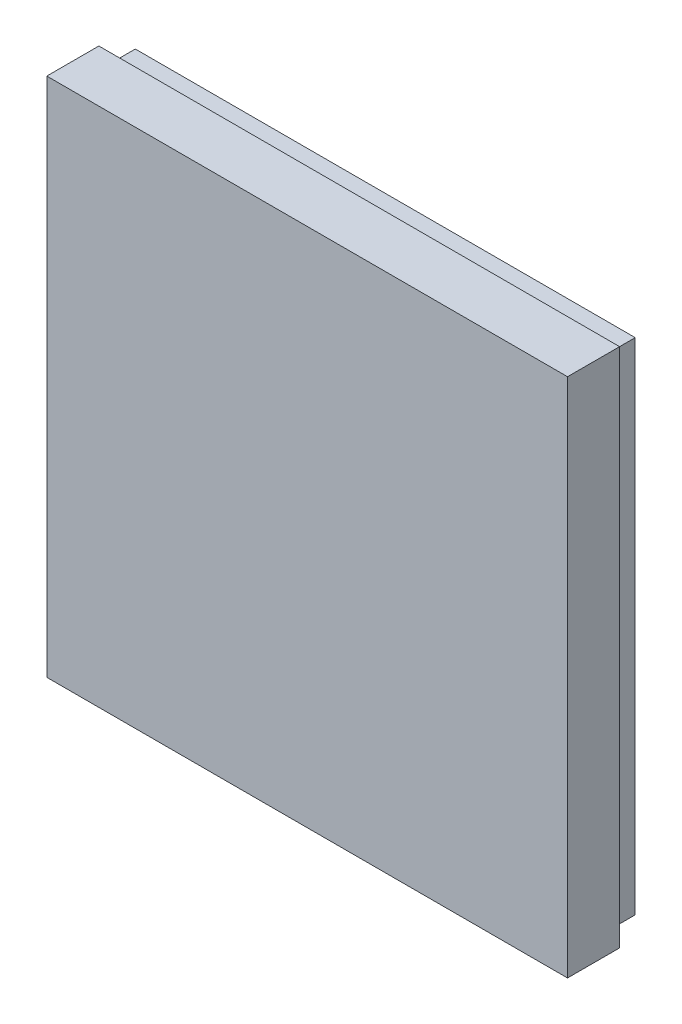
ISO-10303-21;
HEADER;
FILE_DESCRIPTION(('STEP AP214'),'2;1');
FILE_NAME('part.step','',(''),(''),'','','');
FILE_SCHEMA(('AUTOMOTIVE_DESIGN { 1 0 10303 214 1 1 1 1 }'));
ENDSEC;
DATA;
#1=APPLICATION_CONTEXT('core data for automotive mechanical design processes');
#2=APPLICATION_PROTOCOL_DEFINITION('international standard','automotive_design',2000,#1);
#3=PRODUCT_CONTEXT('',#1,'mechanical');
#4=PRODUCT('Part','Part','',(#3));
#5=PRODUCT_RELATED_PRODUCT_CATEGORY('part','',(#4));
#6=PRODUCT_DEFINITION_FORMATION('','',#4);
#7=PRODUCT_DEFINITION_CONTEXT('part definition',#1,'design');
#8=PRODUCT_DEFINITION('design','',#6,#7);
#9=PRODUCT_DEFINITION_SHAPE('','',#8);
#10=(LENGTH_UNIT() NAMED_UNIT(*) SI_UNIT(.MILLI.,.METRE.));
#11=(NAMED_UNIT(*) PLANE_ANGLE_UNIT() SI_UNIT($,.RADIAN.));
#12=(NAMED_UNIT(*) SI_UNIT($,.STERADIAN.) SOLID_ANGLE_UNIT());
#13=UNCERTAINTY_MEASURE_WITH_UNIT(LENGTH_MEASURE(1.E-05),#10,'distance_accuracy_value','');
#14=(GEOMETRIC_REPRESENTATION_CONTEXT(3) GLOBAL_UNCERTAINTY_ASSIGNED_CONTEXT((#13)) GLOBAL_UNIT_ASSIGNED_CONTEXT((#10,
#11,#12)) REPRESENTATION_CONTEXT('',''));
#15=CARTESIAN_POINT('',(0.,0.,0.));
#16=DIRECTION('',(0.,0.,1.));
#17=DIRECTION('',(1.,0.,0.));
#18=AXIS2_PLACEMENT_3D('',#15,#16,#17);
#19=CARTESIAN_POINT('',(-75.8471431350078,-69.5422853868556,0.));
#20=DIRECTION('',(0.,0.,1.));
#21=DIRECTION('',(1.,0.,0.));
#22=AXIS2_PLACEMENT_3D('',#19,#20,#21);
#23=PLANE('',#22);
#24=DIRECTION('',(0.,-1.,0.));
#25=VECTOR('',#24,1.);
#26=CARTESIAN_POINT('',(-75.8471431350078,30.4577146131444,0.));
#27=LINE('',#26,#25);
#28=CARTESIAN_POINT('',(-75.8471431350078,30.4577146131444,0.));
#29=VERTEX_POINT('',#28);
#30=CARTESIAN_POINT('',(-75.8471431350078,-69.5422853868556,0.));
#31=VERTEX_POINT('',#30);
#32=EDGE_CURVE('E123',#29,#31,#27,.T.);
#33=ORIENTED_EDGE('',*,*,#32,.F.);
#34=DIRECTION('',(-1.,0.,0.));
#35=VECTOR('',#34,1.);
#36=CARTESIAN_POINT('',(-75.8471431350078,30.4577146131444,0.));
#37=LINE('',#36,#35);
#38=CARTESIAN_POINT('',(24.1528568649922,30.4577146131444,0.));
#39=VERTEX_POINT('',#38);
#40=EDGE_CURVE('E136',#39,#29,#37,.T.);
#41=ORIENTED_EDGE('',*,*,#40,.F.);
#42=DIRECTION('',(0.,1.,0.));
#43=VECTOR('',#42,1.);
#44=CARTESIAN_POINT('',(24.1528568649922,30.4577146131444,0.));
#45=LINE('',#44,#43);
#46=CARTESIAN_POINT('',(24.1528568649922,-69.5422853868556,0.));
#47=VERTEX_POINT('',#46);
#48=EDGE_CURVE('E144',#47,#39,#45,.T.);
#49=ORIENTED_EDGE('',*,*,#48,.F.);
#50=DIRECTION('',(1.,0.,0.));
#51=VECTOR('',#50,1.);
#52=CARTESIAN_POINT('',(-75.8471431350078,-69.5422853868556,0.));
#53=LINE('',#52,#51);
#54=EDGE_CURVE('E126',#31,#47,#53,.T.);
#55=ORIENTED_EDGE('',*,*,#54,.F.);
#56=EDGE_LOOP('',(#33,#41,#49,#55));
#57=FACE_BOUND('',#56,.T.);
#58=DIRECTION('',(0.,-1.,0.));
#59=VECTOR('',#58,1.);
#60=CARTESIAN_POINT('',(22.1528568649922,28.4577146131444,0.));
#61=LINE('',#60,#59);
#62=CARTESIAN_POINT('',(22.1528568649922,28.4577146131444,0.));
#63=VERTEX_POINT('',#62);
#64=CARTESIAN_POINT('',(22.1528568649922,-67.5422853868556,0.));
#65=VERTEX_POINT('',#64);
#66=EDGE_CURVE('E122',#63,#65,#61,.T.);
#67=ORIENTED_EDGE('',*,*,#66,.F.);
#68=DIRECTION('',(1.,0.,0.));
#69=VECTOR('',#68,1.);
#70=CARTESIAN_POINT('',(22.1528568649922,28.4577146131444,0.));
#71=LINE('',#70,#69);
#72=CARTESIAN_POINT('',(-73.8471431350078,28.4577146131444,0.));
#73=VERTEX_POINT('',#72);
#74=EDGE_CURVE('E119',#73,#63,#71,.T.);
#75=ORIENTED_EDGE('',*,*,#74,.F.);
#76=DIRECTION('',(0.,1.,0.));
#77=VECTOR('',#76,1.);
#78=CARTESIAN_POINT('',(-73.8471431350078,28.4577146131444,0.));
#79=LINE('',#78,#77);
#80=CARTESIAN_POINT('',(-73.8471431350078,-67.5422853868556,0.));
#81=VERTEX_POINT('',#80);
#82=EDGE_CURVE('E57',#81,#73,#79,.T.);
#83=ORIENTED_EDGE('',*,*,#82,.F.);
#84=DIRECTION('',(-1.,0.,0.));
#85=VECTOR('',#84,1.);
#86=CARTESIAN_POINT('',(22.1528568649922,-67.5422853868556,0.));
#87=LINE('',#86,#85);
#88=EDGE_CURVE('E52',#65,#81,#87,.T.);
#89=ORIENTED_EDGE('',*,*,#88,.F.);
#90=EDGE_LOOP('',(#67,#75,#83,#89));
#91=FACE_BOUND('',#90,.T.);
#92=ADVANCED_FACE('F37',(#57,#91),#23,.F.);
#93=CARTESIAN_POINT('',(-75.8471431350078,30.4577146131444,10.));
#94=DIRECTION('',(1.,0.,0.));
#95=DIRECTION('',(0.,1.,0.));
#96=AXIS2_PLACEMENT_3D('',#93,#94,#95);
#97=PLANE('',#96);
#98=ORIENTED_EDGE('',*,*,#32,.T.);
#99=DIRECTION('',(0.,0.,-1.));
#100=VECTOR('',#99,1.);
#101=CARTESIAN_POINT('',(-75.8471431350078,-69.5422853868556,10.));
#102=LINE('',#101,#100);
#103=CARTESIAN_POINT('',(-75.8471431350078,-69.5422853868556,10.));
#104=VERTEX_POINT('',#103);
#105=EDGE_CURVE('E11',#104,#31,#102,.T.);
#106=ORIENTED_EDGE('',*,*,#105,.F.);
#107=DIRECTION('',(0.,-1.,0.));
#108=VECTOR('',#107,1.);
#109=CARTESIAN_POINT('',(-75.8471431350078,30.4577146131444,10.));
#110=LINE('',#109,#108);
#111=CARTESIAN_POINT('',(-75.8471431350078,30.4577146131444,10.));
#112=VERTEX_POINT('',#111);
#113=EDGE_CURVE('E132',#112,#104,#110,.T.);
#114=ORIENTED_EDGE('',*,*,#113,.F.);
#115=DIRECTION('',(0.,0.,-1.));
#116=VECTOR('',#115,1.);
#117=CARTESIAN_POINT('',(-75.8471431350078,30.4577146131444,10.));
#118=LINE('',#117,#116);
#119=EDGE_CURVE('E141',#112,#29,#118,.T.);
#120=ORIENTED_EDGE('',*,*,#119,.T.);
#121=EDGE_LOOP('',(#98,#106,#114,#120));
#122=FACE_BOUND('',#121,.T.);
#123=ADVANCED_FACE('F39',(#122),#97,.F.);
#124=CARTESIAN_POINT('',(-75.8471431350078,-69.5422853868556,10.));
#125=DIRECTION('',(0.,1.,0.));
#126=DIRECTION('',(0.,0.,1.));
#127=AXIS2_PLACEMENT_3D('',#124,#125,#126);
#128=PLANE('',#127);
#129=ORIENTED_EDGE('',*,*,#54,.T.);
#130=DIRECTION('',(0.,0.,-1.));
#131=VECTOR('',#130,1.);
#132=CARTESIAN_POINT('',(24.1528568649922,-69.5422853868556,10.));
#133=LINE('',#132,#131);
#134=CARTESIAN_POINT('',(24.1528568649922,-69.5422853868556,10.));
#135=VERTEX_POINT('',#134);
#136=EDGE_CURVE('E45',#135,#47,#133,.T.);
#137=ORIENTED_EDGE('',*,*,#136,.F.);
#138=DIRECTION('',(1.,0.,0.));
#139=VECTOR('',#138,1.);
#140=CARTESIAN_POINT('',(-75.8471431350078,-69.5422853868556,10.));
#141=LINE('',#140,#139);
#142=EDGE_CURVE('E135',#104,#135,#141,.T.);
#143=ORIENTED_EDGE('',*,*,#142,.F.);
#144=ORIENTED_EDGE('',*,*,#105,.T.);
#145=EDGE_LOOP('',(#129,#137,#143,#144));
#146=FACE_BOUND('',#145,.T.);
#147=ADVANCED_FACE('F171',(#146),#128,.F.);
#148=CARTESIAN_POINT('',(24.1528568649922,30.4577146131444,10.));
#149=DIRECTION('',(-1.,0.,0.));
#150=DIRECTION('',(0.,-1.,0.));
#151=AXIS2_PLACEMENT_3D('',#148,#149,#150);
#152=PLANE('',#151);
#153=ORIENTED_EDGE('',*,*,#48,.T.);
#154=DIRECTION('',(0.,0.,-1.));
#155=VECTOR('',#154,1.);
#156=CARTESIAN_POINT('',(24.1528568649922,30.4577146131444,10.));
#157=LINE('',#156,#155);
#158=CARTESIAN_POINT('',(24.1528568649922,30.4577146131444,10.));
#159=VERTEX_POINT('',#158);
#160=EDGE_CURVE('E149',#159,#39,#157,.T.);
#161=ORIENTED_EDGE('',*,*,#160,.F.);
#162=DIRECTION('',(0.,1.,0.));
#163=VECTOR('',#162,1.);
#164=CARTESIAN_POINT('',(24.1528568649922,30.4577146131444,10.));
#165=LINE('',#164,#163);
#166=EDGE_CURVE('E138',#135,#159,#165,.T.);
#167=ORIENTED_EDGE('',*,*,#166,.F.);
#168=ORIENTED_EDGE('',*,*,#136,.T.);
#169=EDGE_LOOP('',(#153,#161,#167,#168));
#170=FACE_BOUND('',#169,.T.);
#171=ADVANCED_FACE('F156',(#170),#152,.F.);
#172=CARTESIAN_POINT('',(-75.8471431350078,30.4577146131444,10.));
#173=DIRECTION('',(0.,-1.,0.));
#174=DIRECTION('',(0.,0.,-1.));
#175=AXIS2_PLACEMENT_3D('',#172,#173,#174);
#176=PLANE('',#175);
#177=ORIENTED_EDGE('',*,*,#40,.T.);
#178=ORIENTED_EDGE('',*,*,#119,.F.);
#179=DIRECTION('',(-1.,0.,0.));
#180=VECTOR('',#179,1.);
#181=CARTESIAN_POINT('',(-75.8471431350078,30.4577146131444,10.));
#182=LINE('',#181,#180);
#183=EDGE_CURVE('E140',#159,#112,#182,.T.);
#184=ORIENTED_EDGE('',*,*,#183,.F.);
#185=ORIENTED_EDGE('',*,*,#160,.T.);
#186=EDGE_LOOP('',(#177,#178,#184,#185));
#187=FACE_BOUND('',#186,.T.);
#188=ADVANCED_FACE('F164',(#187),#176,.F.);
#189=CARTESIAN_POINT('',(-75.8471431350078,-69.5422853868556,10.));
#190=DIRECTION('',(0.,0.,1.));
#191=DIRECTION('',(1.,0.,0.));
#192=AXIS2_PLACEMENT_3D('',#189,#190,#191);
#193=PLANE('',#192);
#194=ORIENTED_EDGE('',*,*,#113,.T.);
#195=ORIENTED_EDGE('',*,*,#142,.T.);
#196=ORIENTED_EDGE('',*,*,#166,.T.);
#197=ORIENTED_EDGE('',*,*,#183,.T.);
#198=EDGE_LOOP('',(#194,#195,#196,#197));
#199=FACE_BOUND('',#198,.T.);
#200=ADVANCED_FACE('F170',(#199),#193,.T.);
#201=CARTESIAN_POINT('',(22.1528568649922,28.4577146131444,-5.));
#202=DIRECTION('',(-1.,0.,0.));
#203=DIRECTION('',(0.,0.,1.));
#204=AXIS2_PLACEMENT_3D('',#201,#202,#203);
#205=PLANE('',#204);
#206=ORIENTED_EDGE('',*,*,#66,.T.);
#207=DIRECTION('',(0.,0.,1.));
#208=VECTOR('',#207,1.);
#209=CARTESIAN_POINT('',(22.1528568649922,-67.5422853868556,-5.));
#210=LINE('',#209,#208);
#211=CARTESIAN_POINT('',(22.1528568649922,-67.5422853868556,-5.));
#212=VERTEX_POINT('',#211);
#213=EDGE_CURVE('E103',#212,#65,#210,.T.);
#214=ORIENTED_EDGE('',*,*,#213,.F.);
#215=DIRECTION('',(0.,-1.,0.));
#216=VECTOR('',#215,1.);
#217=CARTESIAN_POINT('',(22.1528568649922,28.4577146131444,-5.));
#218=LINE('',#217,#216);
#219=CARTESIAN_POINT('',(22.1528568649922,28.4577146131444,-5.));
#220=VERTEX_POINT('',#219);
#221=EDGE_CURVE('E110',#220,#212,#218,.T.);
#222=ORIENTED_EDGE('',*,*,#221,.F.);
#223=DIRECTION('',(0.,0.,1.));
#224=VECTOR('',#223,1.);
#225=CARTESIAN_POINT('',(22.1528568649922,28.4577146131444,-5.));
#226=LINE('',#225,#224);
#227=EDGE_CURVE('E286',#220,#63,#226,.T.);
#228=ORIENTED_EDGE('',*,*,#227,.T.);
#229=EDGE_LOOP('',(#206,#214,#222,#228));
#230=FACE_BOUND('',#229,.T.);
#231=ADVANCED_FACE('F121',(#230),#205,.F.);
#232=CARTESIAN_POINT('',(22.1528568649922,-67.5422853868556,-5.));
#233=DIRECTION('',(0.,1.,0.));
#234=DIRECTION('',(0.,0.,1.));
#235=AXIS2_PLACEMENT_3D('',#232,#233,#234);
#236=PLANE('',#235);
#237=ORIENTED_EDGE('',*,*,#88,.T.);
#238=DIRECTION('',(0.,0.,1.));
#239=VECTOR('',#238,1.);
#240=CARTESIAN_POINT('',(-73.8471431350078,-67.5422853868556,-5.));
#241=LINE('',#240,#239);
#242=CARTESIAN_POINT('',(-73.8471431350078,-67.5422853868556,-5.));
#243=VERTEX_POINT('',#242);
#244=EDGE_CURVE('E106',#243,#81,#241,.T.);
#245=ORIENTED_EDGE('',*,*,#244,.F.);
#246=DIRECTION('',(-1.,0.,0.));
#247=VECTOR('',#246,1.);
#248=CARTESIAN_POINT('',(22.1528568649922,-67.5422853868556,-5.));
#249=LINE('',#248,#247);
#250=EDGE_CURVE('E99',#212,#243,#249,.T.);
#251=ORIENTED_EDGE('',*,*,#250,.F.);
#252=ORIENTED_EDGE('',*,*,#213,.T.);
#253=EDGE_LOOP('',(#237,#245,#251,#252));
#254=FACE_BOUND('',#253,.T.);
#255=ADVANCED_FACE('F101',(#254),#236,.F.);
#256=CARTESIAN_POINT('',(-73.8471431350078,28.4577146131444,-5.));
#257=DIRECTION('',(1.,0.,0.));
#258=DIRECTION('',(0.,0.,-1.));
#259=AXIS2_PLACEMENT_3D('',#256,#257,#258);
#260=PLANE('',#259);
#261=ORIENTED_EDGE('',*,*,#82,.T.);
#262=DIRECTION('',(0.,0.,1.));
#263=VECTOR('',#262,1.);
#264=CARTESIAN_POINT('',(-73.8471431350078,28.4577146131444,-5.));
#265=LINE('',#264,#263);
#266=CARTESIAN_POINT('',(-73.8471431350078,28.4577146131444,-5.));
#267=VERTEX_POINT('',#266);
#268=EDGE_CURVE('E128',#267,#73,#265,.T.);
#269=ORIENTED_EDGE('',*,*,#268,.F.);
#270=DIRECTION('',(0.,1.,0.));
#271=VECTOR('',#270,1.);
#272=CARTESIAN_POINT('',(-73.8471431350078,28.4577146131444,-5.));
#273=LINE('',#272,#271);
#274=EDGE_CURVE('E109',#243,#267,#273,.T.);
#275=ORIENTED_EDGE('',*,*,#274,.F.);
#276=ORIENTED_EDGE('',*,*,#244,.T.);
#277=EDGE_LOOP('',(#261,#269,#275,#276));
#278=FACE_BOUND('',#277,.T.);
#279=ADVANCED_FACE('F195',(#278),#260,.F.);
#280=CARTESIAN_POINT('',(22.1528568649922,28.4577146131444,-5.));
#281=DIRECTION('',(0.,-1.,0.));
#282=DIRECTION('',(0.,0.,-1.));
#283=AXIS2_PLACEMENT_3D('',#280,#281,#282);
#284=PLANE('',#283);
#285=ORIENTED_EDGE('',*,*,#74,.T.);
#286=ORIENTED_EDGE('',*,*,#227,.F.);
#287=DIRECTION('',(1.,0.,0.));
#288=VECTOR('',#287,1.);
#289=CARTESIAN_POINT('',(22.1528568649922,28.4577146131444,-5.));
#290=LINE('',#289,#288);
#291=EDGE_CURVE('E115',#267,#220,#290,.T.);
#292=ORIENTED_EDGE('',*,*,#291,.F.);
#293=ORIENTED_EDGE('',*,*,#268,.T.);
#294=EDGE_LOOP('',(#285,#286,#292,#293));
#295=FACE_BOUND('',#294,.T.);
#296=ADVANCED_FACE('F200',(#295),#284,.F.);
#297=CARTESIAN_POINT('',(22.1528568649922,-67.5422853868556,-5.));
#298=DIRECTION('',(0.,0.,-1.));
#299=DIRECTION('',(-1.,0.,0.));
#300=AXIS2_PLACEMENT_3D('',#297,#298,#299);
#301=PLANE('',#300);
#302=ORIENTED_EDGE('',*,*,#221,.T.);
#303=ORIENTED_EDGE('',*,*,#250,.T.);
#304=ORIENTED_EDGE('',*,*,#274,.T.);
#305=ORIENTED_EDGE('',*,*,#291,.T.);
#306=EDGE_LOOP('',(#302,#303,#304,#305));
#307=FACE_BOUND('',#306,.T.);
#308=ADVANCED_FACE('F113',(#307),#301,.T.);
#309=CLOSED_SHELL('',(#92,#123,#147,#171,#188,#200,#231,#255,#279,#296,#308));
#310=MANIFOLD_SOLID_BREP('B2',#309);
#311=ADVANCED_BREP_SHAPE_REPRESENTATION('',(#18,#310),#14);
#312=SHAPE_DEFINITION_REPRESENTATION(#9,#311);
ENDSEC;
END-ISO-10303-21;
